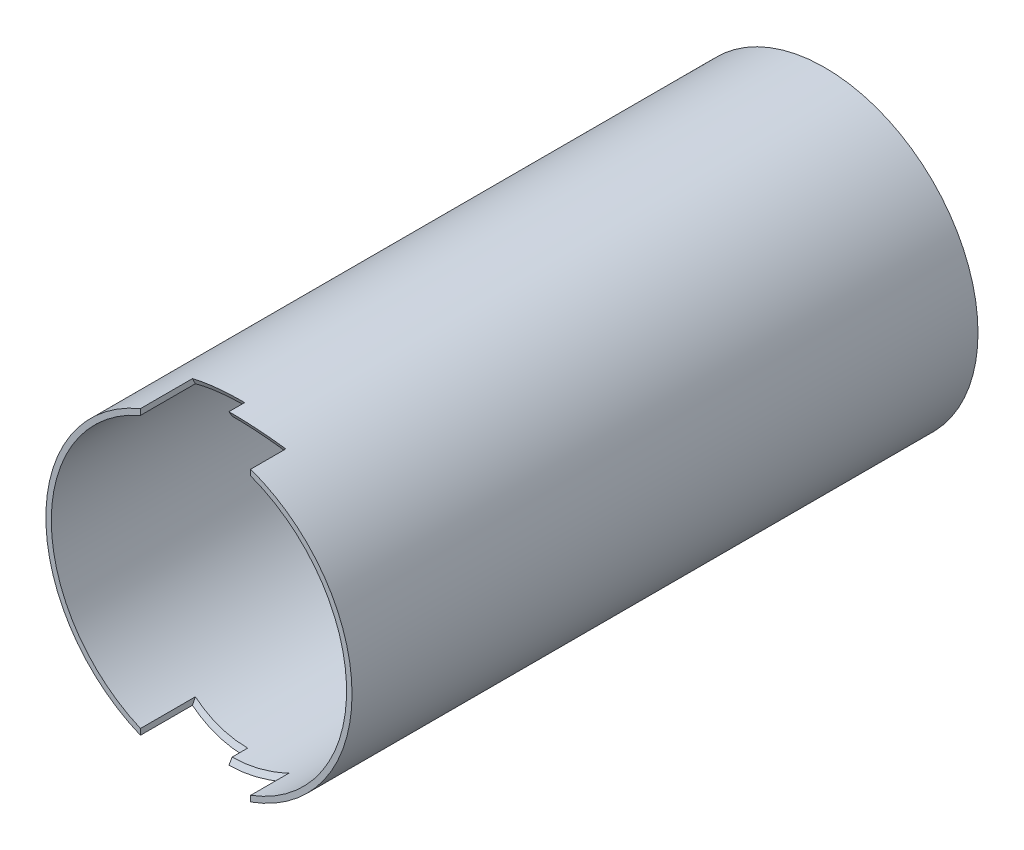
ISO-10303-21;
HEADER;
FILE_DESCRIPTION(('STEP AP214'),'2;1');
FILE_NAME('part.step','',(''),(''),'','','');
FILE_SCHEMA(('AUTOMOTIVE_DESIGN { 1 0 10303 214 1 1 1 1 }'));
ENDSEC;
DATA;
#1=APPLICATION_CONTEXT('core data for automotive mechanical design processes');
#2=APPLICATION_PROTOCOL_DEFINITION('international standard','automotive_design',2000,#1);
#3=PRODUCT_CONTEXT('',#1,'mechanical');
#4=PRODUCT('Part','Part','',(#3));
#5=PRODUCT_RELATED_PRODUCT_CATEGORY('part','',(#4));
#6=PRODUCT_DEFINITION_FORMATION('','',#4);
#7=PRODUCT_DEFINITION_CONTEXT('part definition',#1,'design');
#8=PRODUCT_DEFINITION('design','',#6,#7);
#9=PRODUCT_DEFINITION_SHAPE('','',#8);
#10=(LENGTH_UNIT() NAMED_UNIT(*) SI_UNIT(.MILLI.,.METRE.));
#11=(NAMED_UNIT(*) PLANE_ANGLE_UNIT() SI_UNIT($,.RADIAN.));
#12=(NAMED_UNIT(*) SI_UNIT($,.STERADIAN.) SOLID_ANGLE_UNIT());
#13=UNCERTAINTY_MEASURE_WITH_UNIT(LENGTH_MEASURE(1.E-05),#10,'distance_accuracy_value','');
#14=(GEOMETRIC_REPRESENTATION_CONTEXT(3) GLOBAL_UNCERTAINTY_ASSIGNED_CONTEXT((#13)) GLOBAL_UNIT_ASSIGNED_CONTEXT((#10,
#11,#12)) REPRESENTATION_CONTEXT('',''));
#15=CARTESIAN_POINT('',(0.,0.,0.));
#16=DIRECTION('',(0.,0.,1.));
#17=DIRECTION('',(1.,0.,0.));
#18=AXIS2_PLACEMENT_3D('',#15,#16,#17);
#19=CARTESIAN_POINT('',(0.,0.,92.));
#20=DIRECTION('',(0.,0.,-1.));
#21=DIRECTION('',(-1.,0.,0.));
#22=AXIS2_PLACEMENT_3D('',#19,#20,#21);
#23=CYLINDRICAL_SURFACE('',#22,22.499999958);
#24=CARTESIAN_POINT('',(0.,0.,0.));
#25=DIRECTION('',(0.,0.,1.));
#26=DIRECTION('',(1.,0.,0.));
#27=AXIS2_PLACEMENT_3D('',#24,#25,#26);
#28=CIRCLE('',#27,22.499999958);
#29=CARTESIAN_POINT('',(22.499999958,0.,0.));
#30=VERTEX_POINT('',#29);
#31=EDGE_CURVE('E250',#30,#30,#28,.T.);
#32=ORIENTED_EDGE('',*,*,#31,.T.);
#33=EDGE_LOOP('',(#32));
#34=FACE_BOUND('',#33,.T.);
#35=CARTESIAN_POINT('',(0.,-22.499999958,87.595822400566));
#36=CARTESIAN_POINT('',(0.326653760988415,-22.5000106696045,87.5958404011835));
#37=CARTESIAN_POINT('',(0.65329863988078,-22.4928865916894,87.5915437415341));
#38=CARTESIAN_POINT('',(1.30572817236054,-22.4644510341596,87.5744546707883));
#39=CARTESIAN_POINT('',(1.63151287773196,-22.4431404290975,87.5616627833947));
#40=CARTESIAN_POINT('',(2.27835373031811,-22.3866816184737,87.5278769571298));
#41=CARTESIAN_POINT('',(2.59942548859575,-22.3516658855967,87.5069615539345));
#42=CARTESIAN_POINT('',(3.23912144425534,-22.2679638994266,87.4571894280459));
#43=CARTESIAN_POINT('',(3.5577456484827,-22.219277684382,87.4283327275717));
#44=CARTESIAN_POINT('',(4.50881756094309,-22.0529886592313,87.3303163583322));
#45=CARTESIAN_POINT('',(5.13674968302772,-21.9151304000457,87.2496950827573));
#46=CARTESIAN_POINT('',(6.06789099168522,-21.6687649911111,87.1081003788189));
#47=CARTESIAN_POINT('',(6.37796013642143,-21.5795145542289,87.0571593088207));
#48=CARTESIAN_POINT('',(6.99294379656184,-21.3881351427137,86.9489522557165));
#49=CARTESIAN_POINT('',(7.29785885412469,-21.2860075323126,86.8916869426923));
#50=CARTESIAN_POINT('',(7.6,-21.1775824425263,86.83152476336));
#51=B_SPLINE_CURVE_WITH_KNOTS('',3,(#35,#36,#37,#38,#39,#40,#41,#42,#43,#44,#45,#46,#47,#48,#49,
#50),.UNSPECIFIED.,.F.,.F.,(4,2,2,2,2,2,2,4),(0.,0.979839623226993,1.95961884816871,
2.93015262652947,3.9006836894698,5.84088950282509,6.820570437205,7.80014766942476),.UNSPECIFIED.);
#52=CARTESIAN_POINT('',(0.,-22.499999958,87.595822400566));
#53=VERTEX_POINT('',#52);
#54=CARTESIAN_POINT('',(7.6,-21.1775824425263,86.83152476336));
#55=VERTEX_POINT('',#54);
#56=EDGE_CURVE('E140',#53,#55,#51,.T.);
#57=ORIENTED_EDGE('',*,*,#56,.F.);
#58=DIRECTION('',(0.,0.,-1.));
#59=VECTOR('',#58,1.);
#60=CARTESIAN_POINT('',(0.,-22.499999958,92.));
#61=LINE('',#60,#59);
#62=CARTESIAN_POINT('',(0.,-22.499999958,85.2800742461671));
#63=VERTEX_POINT('',#62);
#64=EDGE_CURVE('E182',#53,#63,#61,.T.);
#65=ORIENTED_EDGE('',*,*,#64,.T.);
#66=CARTESIAN_POINT('',(0.,-22.499999958,85.2800742461671));
#67=CARTESIAN_POINT('',(-0.289747889985323,-22.5000017117664,85.2800802206657));
#68=CARTESIAN_POINT('',(-0.579455614697098,-22.4944017833368,85.2769024527988));
#69=CARTESIAN_POINT('',(-1.15829352272862,-22.4720325913717,85.2642416553458));
#70=CARTESIAN_POINT('',(-1.44742372228295,-22.4552636463653,85.2547588055743));
#71=CARTESIAN_POINT('',(-2.31308514385281,-22.3882648311387,85.2169518863606));
#72=CARTESIAN_POINT('',(-2.88803015065534,-22.3213429469182,85.1792693880986));
#73=CARTESIAN_POINT('',(-4.01894374186767,-22.1454289019554,85.0811782645428));
#74=CARTESIAN_POINT('',(-4.57506830008712,-22.0371948643332,85.0211796438636));
#75=CARTESIAN_POINT('',(-5.67488236068313,-21.7799080073424,84.880434005604));
#76=CARTESIAN_POINT('',(-6.21857753131415,-21.6308742134034,84.7996966598273));
#77=CARTESIAN_POINT('',(-7.06688865709348,-21.3639057522024,84.6574866246253));
#78=CARTESIAN_POINT('',(-7.37667187452284,-21.258912069602,84.602016806298));
#79=CARTESIAN_POINT('',(-7.9920464343943,-21.035325039902,84.485144242499));
#80=CARTESIAN_POINT('',(-8.29760740657347,-20.9166634833792,84.423712004321));
#81=CARTESIAN_POINT('',(-8.6,-20.7915847907272,84.3597182355978));
#82=B_SPLINE_CURVE_WITH_KNOTS('',3,(#66,#67,#68,#69,#70,#71,#72,#73,#74,#75,#76,#77,#78,#79,#80,
#81),.UNSPECIFIED.,.F.,.F.,(4,2,2,2,2,2,2,4),(0.,0.869092715258865,1.73816064593661,
3.47586913805701,5.18311301752126,6.88956214018648,7.88453216274369,8.88470230189268),.UNSPECIFIED.);
#83=CARTESIAN_POINT('',(-8.6,-20.7915847907272,84.3597182355978));
#84=VERTEX_POINT('',#83);
#85=EDGE_CURVE('E192',#63,#84,#82,.T.);
#86=ORIENTED_EDGE('',*,*,#85,.T.);
#87=DIRECTION('',(0.,0.,-1.));
#88=VECTOR('',#87,1.);
#89=CARTESIAN_POINT('',(-8.6,-20.7915847907272,92.));
#90=LINE('',#89,#88);
#91=CARTESIAN_POINT('',(-8.6,-20.7915847907272,92.));
#92=VERTEX_POINT('',#91);
#93=EDGE_CURVE('E190',#92,#84,#90,.T.);
#94=ORIENTED_EDGE('',*,*,#93,.F.);
#95=CARTESIAN_POINT('',(0.,0.,92.));
#96=DIRECTION('',(0.,0.,1.));
#97=DIRECTION('',(1.,0.,0.));
#98=AXIS2_PLACEMENT_3D('',#95,#96,#97);
#99=CIRCLE('',#98,22.499999958);
#100=CARTESIAN_POINT('',(-8.6,20.7915847907272,92.));
#101=VERTEX_POINT('',#100);
#102=EDGE_CURVE('E249',#101,#92,#99,.T.);
#103=ORIENTED_EDGE('',*,*,#102,.F.);
#104=DIRECTION('',(0.,0.,-1.));
#105=VECTOR('',#104,1.);
#106=CARTESIAN_POINT('',(-8.6,20.7915847907272,92.));
#107=LINE('',#106,#105);
#108=CARTESIAN_POINT('',(-8.6,20.7915847907272,84.3597182355978));
#109=VERTEX_POINT('',#108);
#110=EDGE_CURVE('E187',#109,#101,#107,.F.);
#111=ORIENTED_EDGE('',*,*,#110,.F.);
#112=CARTESIAN_POINT('',(-8.6,20.7915847907272,84.3597182355978));
#113=CARTESIAN_POINT('',(-8.33731516708101,20.9002374727954,84.415306592474));
#114=CARTESIAN_POINT('',(-8.07224929765128,21.0040466722844,84.4689633209272));
#115=CARTESIAN_POINT('',(-7.53762172879687,21.2017813492647,84.5720465604728));
#116=CARTESIAN_POINT('',(-7.26805965751998,21.2957060045257,84.6214727195882));
#117=CARTESIAN_POINT('',(-6.45266215532253,21.5624735720013,84.7629164170083));
#118=CARTESIAN_POINT('',(-5.90053465373324,21.7201363981195,84.8480094664314));
#119=CARTESIAN_POINT('',(-4.79353174948434,21.9906980138407,84.9955624536223));
#120=CARTESIAN_POINT('',(-4.23889661245493,22.1043717566811,85.0584123705775));
#121=CARTESIAN_POINT('',(-3.12092860980761,22.2896927751119,85.1615335167311));
#122=CARTESIAN_POINT('',(-2.55760315650428,22.3613740317663,85.2018230010624));
#123=CARTESIAN_POINT('',(-1.66193138156028,22.4409852126447,85.2466887911681));
#124=CARTESIAN_POINT('',(-1.33115764226046,22.463033770526,85.2591510142154));
#125=CARTESIAN_POINT('',(-0.666940913431862,22.4925843251712,85.2758730548787));
#126=CARTESIAN_POINT('',(-0.33349321896062,22.5000061111026,85.2800876429273));
#127=CARTESIAN_POINT('',(0.,22.499999958,85.2800742461671));
#128=B_SPLINE_CURVE_WITH_KNOTS('',3,(#112,#113,#114,#115,#116,#117,#118,#119,#120,#121,#122,
#123,#124,#125,#126,#127),.UNSPECIFIED.,.F.,.F.,(4,2,2,2,2,2,2,4),(0.,0.868841110083102,
1.73775443631759,3.4769646494049,5.1839646841157,6.88958146921509,7.88442211539244,
8.884703290657),.UNSPECIFIED.);
#129=CARTESIAN_POINT('',(0.,22.499999958,85.2800742461671));
#130=VERTEX_POINT('',#129);
#131=EDGE_CURVE('E200',#109,#130,#128,.T.);
#132=ORIENTED_EDGE('',*,*,#131,.T.);
#133=DIRECTION('',(0.,0.,-1.));
#134=VECTOR('',#133,1.);
#135=CARTESIAN_POINT('',(0.,22.499999958,92.));
#136=LINE('',#135,#134);
#137=CARTESIAN_POINT('',(0.,22.499999958,87.595822400566));
#138=VERTEX_POINT('',#137);
#139=EDGE_CURVE('E175',#130,#138,#136,.F.);
#140=ORIENTED_EDGE('',*,*,#139,.T.);
#141=CARTESIAN_POINT('',(7.6,21.1775824425263,86.83152476336));
#142=CARTESIAN_POINT('',(7.29785885412469,21.2860075323126,86.8916869426923));
#143=CARTESIAN_POINT('',(6.99294379656183,21.3881351427137,86.9489522557165));
#144=CARTESIAN_POINT('',(6.37796013642143,21.5795145542289,87.0571593088207));
#145=CARTESIAN_POINT('',(6.06789099168521,21.6687649911111,87.1081003788189));
#146=CARTESIAN_POINT('',(5.13674968302772,21.9151304000457,87.2496950827573));
#147=CARTESIAN_POINT('',(4.50881756094309,22.0529886592313,87.3303163583322));
#148=CARTESIAN_POINT('',(3.5577456484827,22.219277684382,87.4283327275717));
#149=CARTESIAN_POINT('',(3.23912144425534,22.2679638994266,87.4571894280459));
#150=CARTESIAN_POINT('',(2.59942548859575,22.3516658855967,87.5069615539345));
#151=CARTESIAN_POINT('',(2.27835373031811,22.3866816184737,87.5278769571298));
#152=CARTESIAN_POINT('',(1.63151287773196,22.4431404290975,87.5616627833947));
#153=CARTESIAN_POINT('',(1.30572817236055,22.4644510341596,87.5744546707883));
#154=CARTESIAN_POINT('',(0.653298639880782,22.4928865916894,87.5915437415341));
#155=CARTESIAN_POINT('',(0.326653760988417,22.5000106696045,87.5958404011835));
#156=CARTESIAN_POINT('',(0.,22.499999958,87.595822400566));
#157=B_SPLINE_CURVE_WITH_KNOTS('',3,(#141,#142,#143,#144,#145,#146,#147,#148,#149,#150,#151,
#152,#153,#154,#155,#156),.UNSPECIFIED.,.F.,.F.,(4,2,2,2,2,2,2,4),(0.,0.979577232219755,
1.95925816659967,3.89946397995496,4.86999504289528,5.84052882125604,6.82030804619776,
7.80014766942476),.UNSPECIFIED.);
#158=CARTESIAN_POINT('',(7.6,21.1775824425263,86.83152476336));
#159=VERTEX_POINT('',#158);
#160=EDGE_CURVE('E58',#159,#138,#157,.T.);
#161=ORIENTED_EDGE('',*,*,#160,.F.);
#162=DIRECTION('',(0.,0.,-1.));
#163=VECTOR('',#162,1.);
#164=CARTESIAN_POINT('',(7.6,21.1775824425263,92.));
#165=LINE('',#164,#163);
#166=CARTESIAN_POINT('',(7.6,21.1775824425263,92.));
#167=VERTEX_POINT('',#166);
#168=EDGE_CURVE('E147',#159,#167,#165,.F.);
#169=ORIENTED_EDGE('',*,*,#168,.T.);
#170=CARTESIAN_POINT('',(7.6,-21.1775824425263,92.));
#171=VERTEX_POINT('',#170);
#172=EDGE_CURVE('E246',#171,#167,#99,.T.);
#173=ORIENTED_EDGE('',*,*,#172,.F.);
#174=DIRECTION('',(0.,0.,-1.));
#175=VECTOR('',#174,1.);
#176=CARTESIAN_POINT('',(7.6,-21.1775824425263,92.));
#177=LINE('',#176,#175);
#178=EDGE_CURVE('E168',#171,#55,#177,.T.);
#179=ORIENTED_EDGE('',*,*,#178,.T.);
#180=EDGE_LOOP('',(#57,#65,#86,#94,#103,#111,#132,#140,#161,#169,#173,#179));
#181=FACE_BOUND('',#180,.T.);
#182=ADVANCED_FACE('F43',(#34,#181),#23,.T.);
#183=CARTESIAN_POINT('',(0.,0.,92.));
#184=DIRECTION('',(0.,0.,-1.));
#185=DIRECTION('',(-1.,0.,0.));
#186=AXIS2_PLACEMENT_3D('',#183,#184,#185);
#187=CYLINDRICAL_SURFACE('',#186,21.699999958);
#188=CARTESIAN_POINT('',(0.,0.,0.));
#189=DIRECTION('',(0.,0.,1.));
#190=DIRECTION('',(1.,0.,0.));
#191=AXIS2_PLACEMENT_3D('',#188,#189,#190);
#192=CIRCLE('',#191,21.699999958);
#193=CARTESIAN_POINT('',(21.699999958,0.,0.));
#194=VERTEX_POINT('',#193);
#195=EDGE_CURVE('E258',#194,#194,#192,.T.);
#196=ORIENTED_EDGE('',*,*,#195,.F.);
#197=EDGE_LOOP('',(#196));
#198=FACE_BOUND('',#197,.T.);
#199=DIRECTION('',(0.,0.,-1.));
#200=VECTOR('',#199,1.);
#201=CARTESIAN_POINT('',(0.,-21.699999958,92.));
#202=LINE('',#201,#200);
#203=CARTESIAN_POINT('',(0.,-21.699999958,87.1260973515694));
#204=VERTEX_POINT('',#203);
#205=CARTESIAN_POINT('',(0.,-21.699999958,84.8374241137001));
#206=VERTEX_POINT('',#205);
#207=EDGE_CURVE('E238',#204,#206,#202,.T.);
#208=ORIENTED_EDGE('',*,*,#207,.F.);
#209=CARTESIAN_POINT('',(0.,-21.699999958,87.1260973515694));
#210=CARTESIAN_POINT('',(0.327191308637051,-21.700011293697,87.1261158944691));
#211=CARTESIAN_POINT('',(0.654373341674248,-21.6926000498355,87.1218578531179));
#212=CARTESIAN_POINT('',(1.30783107367683,-21.6630195000894,87.1049262096373));
#213=CARTESIAN_POINT('',(1.63410682954101,-21.6408511427392,87.0922531483952));
#214=CARTESIAN_POINT('',(2.28167364536755,-21.5821365641727,87.0587960683333));
#215=CARTESIAN_POINT('',(2.60298202343422,-21.5457353756772,87.0380938830622));
#216=CARTESIAN_POINT('',(3.24302174613944,-21.4587322135688,86.9888466328446));
#217=CARTESIAN_POINT('',(3.56175309873802,-21.4081302838371,86.960301592133));
#218=CARTESIAN_POINT('',(4.51289460463972,-21.2353136572047,86.8633806934062));
#219=CARTESIAN_POINT('',(5.14054986803604,-21.0920609372761,86.7837032017447));
#220=CARTESIAN_POINT('',(6.07069067390255,-20.8360699113787,86.6439038707417));
#221=CARTESIAN_POINT('',(6.38040307517544,-20.7433052649614,86.5936131268847));
#222=CARTESIAN_POINT('',(6.99438688902998,-20.5444046030855,86.4868509028941));
#223=CARTESIAN_POINT('',(7.29865888094692,-20.4382700211582,86.4303800854761));
#224=CARTESIAN_POINT('',(7.6,-20.3255995773114,86.3710924070742));
#225=B_SPLINE_CURVE_WITH_KNOTS('',3,(#209,#210,#211,#212,#213,#214,#215,#216,#217,#218,#219,
#220,#221,#222,#223,#224),.UNSPECIFIED.,.F.,.F.,(4,2,2,2,2,2,2,4),(0.,0.981445873275006,
1.96282866882051,2.9344613910118,3.90609111083683,5.8484564991179,6.82973858211525,
7.81091554096524),.UNSPECIFIED.);
#226=CARTESIAN_POINT('',(7.6,-20.3255995773114,86.3710924070742));
#227=VERTEX_POINT('',#226);
#228=EDGE_CURVE('E66',#204,#227,#225,.T.);
#229=ORIENTED_EDGE('',*,*,#228,.T.);
#230=DIRECTION('',(0.,0.,-1.));
#231=VECTOR('',#230,1.);
#232=CARTESIAN_POINT('',(7.6,-20.3255995773114,92.));
#233=LINE('',#232,#231);
#234=CARTESIAN_POINT('',(7.6,-20.3255995773114,92.));
#235=VERTEX_POINT('',#234);
#236=EDGE_CURVE('E157',#235,#227,#233,.T.);
#237=ORIENTED_EDGE('',*,*,#236,.F.);
#238=CARTESIAN_POINT('',(0.,0.,92.));
#239=DIRECTION('',(0.,0.,1.));
#240=DIRECTION('',(1.,0.,0.));
#241=AXIS2_PLACEMENT_3D('',#238,#239,#240);
#242=CIRCLE('',#241,21.699999958);
#243=CARTESIAN_POINT('',(7.6,20.3255995773114,92.));
#244=VERTEX_POINT('',#243);
#245=EDGE_CURVE('E155',#235,#244,#242,.T.);
#246=ORIENTED_EDGE('',*,*,#245,.T.);
#247=DIRECTION('',(0.,0.,-1.));
#248=VECTOR('',#247,1.);
#249=CARTESIAN_POINT('',(7.6,20.3255995773114,92.));
#250=LINE('',#249,#248);
#251=CARTESIAN_POINT('',(7.6,20.3255995773114,86.3710924070742));
#252=VERTEX_POINT('',#251);
#253=EDGE_CURVE('E144',#252,#244,#250,.F.);
#254=ORIENTED_EDGE('',*,*,#253,.F.);
#255=CARTESIAN_POINT('',(7.6,20.3255995773114,86.3710924070742));
#256=CARTESIAN_POINT('',(7.29865888094692,20.4382700211582,86.4303800854761));
#257=CARTESIAN_POINT('',(6.99438688902998,20.5444046030855,86.4868509028941));
#258=CARTESIAN_POINT('',(6.38040307517544,20.7433052649614,86.5936131268847));
#259=CARTESIAN_POINT('',(6.07069067390255,20.8360699113787,86.6439038707417));
#260=CARTESIAN_POINT('',(5.14054986803604,21.0920609372761,86.7837032017447));
#261=CARTESIAN_POINT('',(4.51289460463972,21.2353136572047,86.8633806934062));
#262=CARTESIAN_POINT('',(3.56175309873802,21.4081302838371,86.960301592133));
#263=CARTESIAN_POINT('',(3.24302174613944,21.4587322135688,86.9888466328446));
#264=CARTESIAN_POINT('',(2.60298202343422,21.5457353756772,87.0380938830622));
#265=CARTESIAN_POINT('',(2.28167364536755,21.5821365641727,87.0587960683333));
#266=CARTESIAN_POINT('',(1.63410682954101,21.6408511427392,87.0922531483952));
#267=CARTESIAN_POINT('',(1.30783107367683,21.6630195000894,87.1049262096373));
#268=CARTESIAN_POINT('',(0.654373341674249,21.6926000498355,87.1218578531179));
#269=CARTESIAN_POINT('',(0.327191308637051,21.700011293697,87.1261158944691));
#270=CARTESIAN_POINT('',(0.,21.699999958,87.1260973515694));
#271=B_SPLINE_CURVE_WITH_KNOTS('',3,(#255,#256,#257,#258,#259,#260,#261,#262,#263,#264,#265,
#266,#267,#268,#269,#270),.UNSPECIFIED.,.F.,.F.,(4,2,2,2,2,2,2,4),(0.,0.981176958849986,
1.96245904184734,3.90482443012841,4.87645414995344,5.84808687214473,6.82946966769023,
7.81091554096524),.UNSPECIFIED.);
#272=CARTESIAN_POINT('',(0.,21.699999958,87.1260973515694));
#273=VERTEX_POINT('',#272);
#274=EDGE_CURVE('E131',#252,#273,#271,.T.);
#275=ORIENTED_EDGE('',*,*,#274,.T.);
#276=DIRECTION('',(0.,0.,-1.));
#277=VECTOR('',#276,1.);
#278=CARTESIAN_POINT('',(0.,21.699999958,92.));
#279=LINE('',#278,#277);
#280=CARTESIAN_POINT('',(0.,21.699999958,84.8374241137001));
#281=VERTEX_POINT('',#280);
#282=EDGE_CURVE('E253',#281,#273,#279,.F.);
#283=ORIENTED_EDGE('',*,*,#282,.F.);
#284=CARTESIAN_POINT('',(-8.6,19.9231021223403,83.926985722706));
#285=CARTESIAN_POINT('',(-8.34552971252175,20.0329453458654,83.9802683751697));
#286=CARTESIAN_POINT('',(-8.0886703279078,20.138037647902,84.0317875990958));
#287=CARTESIAN_POINT('',(-7.5704367962056,20.3385278782182,84.1309492305323));
#288=CARTESIAN_POINT('',(-7.30906230139621,20.4339250559203,84.1785913378272));
#289=CARTESIAN_POINT('',(-6.51822859705789,20.7053953507847,84.3152327676915));
#290=CARTESIAN_POINT('',(-5.98243902938886,20.8665830142038,84.3978667768602));
#291=CARTESIAN_POINT('',(-4.90785597272367,21.1448627653412,84.5421034206213));
#292=CARTESIAN_POINT('',(-4.36931281848802,21.262734220535,84.6040756980773));
#293=CARTESIAN_POINT('',(-3.28319326588417,21.457274484448,84.7070721836355));
#294=CARTESIAN_POINT('',(-2.73562414949092,21.5339749787435,84.7481124999652));
#295=CARTESIAN_POINT('',(-1.8238842982618,21.6262701843701,84.7976537536254));
#296=CARTESIAN_POINT('',(-1.46121353064582,21.653799764428,84.8124869953041));
#297=CARTESIAN_POINT('',(-0.732383326863415,21.6907285202465,84.8324144489855));
#298=CARTESIAN_POINT('',(-0.366216331243349,21.7000119618528,84.8374464907699));
#299=CARTESIAN_POINT('',(0.,21.699999958,84.8374241137001));
#300=B_SPLINE_CURVE_WITH_KNOTS('',3,(#284,#285,#286,#287,#288,#289,#290,#291,#292,#293,#294,
#295,#296,#297,#298,#299),.UNSPECIFIED.,.F.,.F.,(4,2,2,2,2,2,2,4),(0.,0.846606216909331,
1.69327792657381,3.38788232899199,5.050300838455,6.71143809320965,7.80293791558016,
8.90133899398691),.UNSPECIFIED.);
#301=CARTESIAN_POINT('',(-8.6,19.9231021223403,83.926985722706));
#302=VERTEX_POINT('',#301);
#303=EDGE_CURVE('E221',#302,#281,#300,.T.);
#304=ORIENTED_EDGE('',*,*,#303,.F.);
#305=DIRECTION('',(0.,0.,-1.));
#306=VECTOR('',#305,1.);
#307=CARTESIAN_POINT('',(-8.6,19.9231021223403,92.));
#308=LINE('',#307,#306);
#309=CARTESIAN_POINT('',(-8.6,19.9231021223403,92.));
#310=VERTEX_POINT('',#309);
#311=EDGE_CURVE('E261',#302,#310,#308,.F.);
#312=ORIENTED_EDGE('',*,*,#311,.T.);
#313=CARTESIAN_POINT('',(-8.6,-19.9231021223403,92.));
#314=VERTEX_POINT('',#313);
#315=EDGE_CURVE('E255',#310,#314,#242,.T.);
#316=ORIENTED_EDGE('',*,*,#315,.T.);
#317=DIRECTION('',(0.,0.,-1.));
#318=VECTOR('',#317,1.);
#319=CARTESIAN_POINT('',(-8.6,-19.9231021223403,92.));
#320=LINE('',#319,#318);
#321=CARTESIAN_POINT('',(-8.6,-19.9231021223403,83.926985722706));
#322=VERTEX_POINT('',#321);
#323=EDGE_CURVE('E237',#314,#322,#320,.T.);
#324=ORIENTED_EDGE('',*,*,#323,.T.);
#325=CARTESIAN_POINT('',(0.,-21.699999958,84.8374241137001));
#326=CARTESIAN_POINT('',(-0.282318749791375,-21.7000014325346,84.8374295769837));
#327=CARTESIAN_POINT('',(-0.564597986365862,-21.6944892209742,84.8344460613235));
#328=CARTESIAN_POINT('',(-1.12859651240034,-21.6724692278,84.8225585070978));
#329=CARTESIAN_POINT('',(-1.41031581384097,-21.6559616840442,84.8136545966059));
#330=CARTESIAN_POINT('',(-2.25379276353061,-21.5900041909036,84.7781540358607));
#331=CARTESIAN_POINT('',(-2.81400850271625,-21.524119347946,84.7427685019928));
#332=CARTESIAN_POINT('',(-3.91563647374383,-21.3509546033498,84.6506682367962));
#333=CARTESIAN_POINT('',(-4.45720555443082,-21.2444444096,84.5943505744531));
#334=CARTESIAN_POINT('',(-5.52825954131612,-20.9912097195877,84.4622153477937));
#335=CARTESIAN_POINT('',(-6.05774973469527,-20.8445031987352,84.3864065006787));
#336=CARTESIAN_POINT('',(-6.75093623445674,-20.6239488963778,84.2743454724799));
#337=CARTESIAN_POINT('',(-6.92152792450345,-20.5673216212801,84.2457108101312));
#338=CARTESIAN_POINT('',(-7.26095667073199,-20.4499567309318,84.1866922130272));
#339=CARTESIAN_POINT('',(-7.42979408534996,-20.3892199751756,84.1563086442516));
#340=CARTESIAN_POINT('',(-7.76666010708949,-20.2633048409812,84.0936930301026));
#341=CARTESIAN_POINT('',(-7.93467756116854,-20.1981017102261,84.0614508721702));
#342=CARTESIAN_POINT('',(-8.26880244654375,-20.063632335271,83.9953811902268));
#343=CARTESIAN_POINT('',(-8.4349095056091,-19.9943653147626,83.9615533635617));
#344=CARTESIAN_POINT('',(-8.6,-19.9231021223403,83.926985722706));
#345=B_SPLINE_CURVE_WITH_KNOTS('',3,(#325,#326,#327,#328,#329,#330,#331,#332,#333,#334,#335,
#336,#337,#338,#339,#340,#341,#342,#343,#344),.UNSPECIFIED.,.F.,.F.,(4,2,2,2,2,2,2,2,2,4),(0.,
0.846808482415812,1.6935986467366,3.38676330919794,5.04932528689501,6.71114499296044,
7.25714133850465,7.80302384024902,8.3522241976341,8.90152981030031),.UNSPECIFIED.);
#346=EDGE_CURVE('E230',#206,#322,#345,.T.);
#347=ORIENTED_EDGE('',*,*,#346,.F.);
#348=EDGE_LOOP('',(#208,#229,#237,#246,#254,#275,#283,#304,#312,#316,#324,#347));
#349=FACE_BOUND('',#348,.T.);
#350=ADVANCED_FACE('F152',(#198,#349),#187,.F.);
#351=CARTESIAN_POINT('',(0.,0.,92.));
#352=DIRECTION('',(0.,0.,1.));
#353=DIRECTION('',(1.,0.,0.));
#354=AXIS2_PLACEMENT_3D('',#351,#352,#353);
#355=PLANE('',#354);
#356=ORIENTED_EDGE('',*,*,#102,.T.);
#357=DIRECTION('',(0.,1.,0.));
#358=VECTOR('',#357,1.);
#359=CARTESIAN_POINT('',(-8.6,0.,92.));
#360=LINE('',#359,#358);
#361=EDGE_CURVE('E188',#92,#314,#360,.T.);
#362=ORIENTED_EDGE('',*,*,#361,.T.);
#363=ORIENTED_EDGE('',*,*,#315,.F.);
#364=EDGE_CURVE('E184',#310,#101,#360,.T.);
#365=ORIENTED_EDGE('',*,*,#364,.T.);
#366=EDGE_LOOP('',(#356,#362,#363,#365));
#367=FACE_BOUND('',#366,.T.);
#368=ADVANCED_FACE('F281',(#367),#355,.T.);
#369=DIRECTION('',(0.,1.,0.));
#370=VECTOR('',#369,1.);
#371=CARTESIAN_POINT('',(7.6,0.,92.));
#372=LINE('',#371,#370);
#373=EDGE_CURVE('E11',#171,#235,#372,.T.);
#374=ORIENTED_EDGE('',*,*,#373,.F.);
#375=ORIENTED_EDGE('',*,*,#172,.T.);
#376=EDGE_CURVE('E47',#244,#167,#372,.T.);
#377=ORIENTED_EDGE('',*,*,#376,.F.);
#378=ORIENTED_EDGE('',*,*,#245,.F.);
#379=EDGE_LOOP('',(#374,#375,#377,#378));
#380=FACE_BOUND('',#379,.T.);
#381=ADVANCED_FACE('F248',(#380),#355,.T.);
#382=CARTESIAN_POINT('',(0.,0.,0.));
#383=DIRECTION('',(0.,0.,1.));
#384=DIRECTION('',(1.,0.,0.));
#385=AXIS2_PLACEMENT_3D('',#382,#383,#384);
#386=PLANE('',#385);
#387=ORIENTED_EDGE('',*,*,#31,.F.);
#388=EDGE_LOOP('',(#387));
#389=FACE_BOUND('',#388,.T.);
#390=ORIENTED_EDGE('',*,*,#195,.T.);
#391=EDGE_LOOP('',(#390));
#392=FACE_BOUND('',#391,.T.);
#393=ADVANCED_FACE('F319',(#389,#392),#386,.F.);
#394=CARTESIAN_POINT('',(0.,0.,125.));
#395=DIRECTION('',(1.,0.,0.));
#396=DIRECTION('',(0.,0.,-1.));
#397=AXIS2_PLACEMENT_3D('',#394,#395,#396);
#398=PLANE('',#397);
#399=CARTESIAN_POINT('',(0.,0.,125.));
#400=DIRECTION('',(1.,0.,0.));
#401=DIRECTION('',(0.,0.,-1.));
#402=AXIS2_PLACEMENT_3D('',#399,#400,#401);
#403=CIRCLE('',#402,43.65);
#404=EDGE_CURVE('E135',#273,#138,#403,.T.);
#405=ORIENTED_EDGE('',*,*,#404,.T.);
#406=ORIENTED_EDGE('',*,*,#139,.F.);
#407=CARTESIAN_POINT('',(0.,0.,125.));
#408=DIRECTION('',(1.,0.,0.));
#409=DIRECTION('',(0.,0.,-1.));
#410=AXIS2_PLACEMENT_3D('',#407,#408,#409);
#411=CIRCLE('',#410,45.65);
#412=EDGE_CURVE('E177',#281,#130,#411,.T.);
#413=ORIENTED_EDGE('',*,*,#412,.F.);
#414=ORIENTED_EDGE('',*,*,#282,.T.);
#415=EDGE_LOOP('',(#405,#406,#413,#414));
#416=FACE_BOUND('',#415,.T.);
#417=ADVANCED_FACE('F314',(#416),#398,.F.);
#418=CARTESIAN_POINT('',(-8.6,0.,125.));
#419=DIRECTION('',(1.,0.,0.));
#420=DIRECTION('',(0.,0.,-1.));
#421=AXIS2_PLACEMENT_3D('',#418,#419,#420);
#422=PLANE('',#421);
#423=ORIENTED_EDGE('',*,*,#110,.T.);
#424=ORIENTED_EDGE('',*,*,#364,.F.);
#425=ORIENTED_EDGE('',*,*,#311,.F.);
#426=CARTESIAN_POINT('',(-8.6,0.,125.));
#427=DIRECTION('',(1.,0.,0.));
#428=DIRECTION('',(0.,0.,-1.));
#429=AXIS2_PLACEMENT_3D('',#426,#427,#428);
#430=CIRCLE('',#429,45.65);
#431=EDGE_CURVE('E172',#302,#109,#430,.T.);
#432=ORIENTED_EDGE('',*,*,#431,.T.);
#433=EDGE_LOOP('',(#423,#424,#425,#432));
#434=FACE_BOUND('',#433,.T.);
#435=ADVANCED_FACE('F212',(#434),#422,.T.);
#436=CARTESIAN_POINT('',(-8.6,0.,125.));
#437=DIRECTION('',(1.,0.,0.));
#438=DIRECTION('',(0.,0.,-1.));
#439=AXIS2_PLACEMENT_3D('',#436,#437,#438);
#440=CYLINDRICAL_SURFACE('',#439,45.65);
#441=ORIENTED_EDGE('',*,*,#431,.F.);
#442=ORIENTED_EDGE('',*,*,#303,.T.);
#443=ORIENTED_EDGE('',*,*,#412,.T.);
#444=ORIENTED_EDGE('',*,*,#131,.F.);
#445=EDGE_LOOP('',(#441,#442,#443,#444));
#446=FACE_BOUND('',#445,.T.);
#447=ADVANCED_FACE('F206',(#446),#440,.F.);
#448=EDGE_CURVE('E171',#63,#206,#411,.T.);
#449=ORIENTED_EDGE('',*,*,#448,.T.);
#450=ORIENTED_EDGE('',*,*,#346,.T.);
#451=EDGE_CURVE('E176',#84,#322,#430,.T.);
#452=ORIENTED_EDGE('',*,*,#451,.F.);
#453=ORIENTED_EDGE('',*,*,#85,.F.);
#454=EDGE_LOOP('',(#449,#450,#452,#453));
#455=FACE_BOUND('',#454,.T.);
#456=ADVANCED_FACE('F211',(#455),#440,.F.);
#457=ORIENTED_EDGE('',*,*,#93,.T.);
#458=ORIENTED_EDGE('',*,*,#451,.T.);
#459=ORIENTED_EDGE('',*,*,#323,.F.);
#460=ORIENTED_EDGE('',*,*,#361,.F.);
#461=EDGE_LOOP('',(#457,#458,#459,#460));
#462=FACE_BOUND('',#461,.T.);
#463=ADVANCED_FACE('F278',(#462),#422,.T.);
#464=CARTESIAN_POINT('',(0.,0.,125.));
#465=DIRECTION('',(1.,0.,0.));
#466=DIRECTION('',(0.,0.,-1.));
#467=AXIS2_PLACEMENT_3D('',#464,#465,#466);
#468=CIRCLE('',#467,43.65);
#469=EDGE_CURVE('E240',#204,#53,#468,.F.);
#470=ORIENTED_EDGE('',*,*,#469,.F.);
#471=ORIENTED_EDGE('',*,*,#207,.T.);
#472=ORIENTED_EDGE('',*,*,#448,.F.);
#473=ORIENTED_EDGE('',*,*,#64,.F.);
#474=EDGE_LOOP('',(#470,#471,#472,#473));
#475=FACE_BOUND('',#474,.T.);
#476=ADVANCED_FACE('F214',(#475),#398,.F.);
#477=CARTESIAN_POINT('',(7.6,0.,125.));
#478=DIRECTION('',(-1.,0.,0.));
#479=DIRECTION('',(0.,0.,1.));
#480=AXIS2_PLACEMENT_3D('',#477,#478,#479);
#481=CYLINDRICAL_SURFACE('',#480,43.65);
#482=ORIENTED_EDGE('',*,*,#56,.T.);
#483=CARTESIAN_POINT('',(7.6,0.,125.));
#484=DIRECTION('',(1.,0.,0.));
#485=DIRECTION('',(0.,0.,-1.));
#486=AXIS2_PLACEMENT_3D('',#483,#484,#485);
#487=CIRCLE('',#486,43.65);
#488=EDGE_CURVE('E148',#55,#227,#487,.T.);
#489=ORIENTED_EDGE('',*,*,#488,.T.);
#490=ORIENTED_EDGE('',*,*,#228,.F.);
#491=ORIENTED_EDGE('',*,*,#469,.T.);
#492=EDGE_LOOP('',(#482,#489,#490,#491));
#493=FACE_BOUND('',#492,.T.);
#494=ADVANCED_FACE('F298',(#493),#481,.F.);
#495=CARTESIAN_POINT('',(7.6,0.,125.));
#496=DIRECTION('',(1.,0.,0.));
#497=DIRECTION('',(0.,0.,-1.));
#498=AXIS2_PLACEMENT_3D('',#495,#496,#497);
#499=PLANE('',#498);
#500=ORIENTED_EDGE('',*,*,#373,.T.);
#501=ORIENTED_EDGE('',*,*,#236,.T.);
#502=ORIENTED_EDGE('',*,*,#488,.F.);
#503=ORIENTED_EDGE('',*,*,#178,.F.);
#504=EDGE_LOOP('',(#500,#501,#502,#503));
#505=FACE_BOUND('',#504,.T.);
#506=ADVANCED_FACE('F299',(#505),#499,.F.);
#507=EDGE_CURVE('E134',#252,#159,#487,.T.);
#508=ORIENTED_EDGE('',*,*,#507,.F.);
#509=ORIENTED_EDGE('',*,*,#253,.T.);
#510=ORIENTED_EDGE('',*,*,#376,.T.);
#511=ORIENTED_EDGE('',*,*,#168,.F.);
#512=EDGE_LOOP('',(#508,#509,#510,#511));
#513=FACE_BOUND('',#512,.T.);
#514=ADVANCED_FACE('F143',(#513),#499,.F.);
#515=ORIENTED_EDGE('',*,*,#160,.T.);
#516=ORIENTED_EDGE('',*,*,#404,.F.);
#517=ORIENTED_EDGE('',*,*,#274,.F.);
#518=ORIENTED_EDGE('',*,*,#507,.T.);
#519=EDGE_LOOP('',(#515,#516,#517,#518));
#520=FACE_BOUND('',#519,.T.);
#521=ADVANCED_FACE('F133',(#520),#481,.F.);
#522=CLOSED_SHELL('',(#182,#350,#368,#381,#393,#417,#435,#447,#456,#463,#476,#494,#506,#514,#521));
#523=MANIFOLD_SOLID_BREP('B2',#522);
#524=ADVANCED_BREP_SHAPE_REPRESENTATION('',(#18,#523),#14);
#525=SHAPE_DEFINITION_REPRESENTATION(#9,#524);
ENDSEC;
END-ISO-10303-21;
